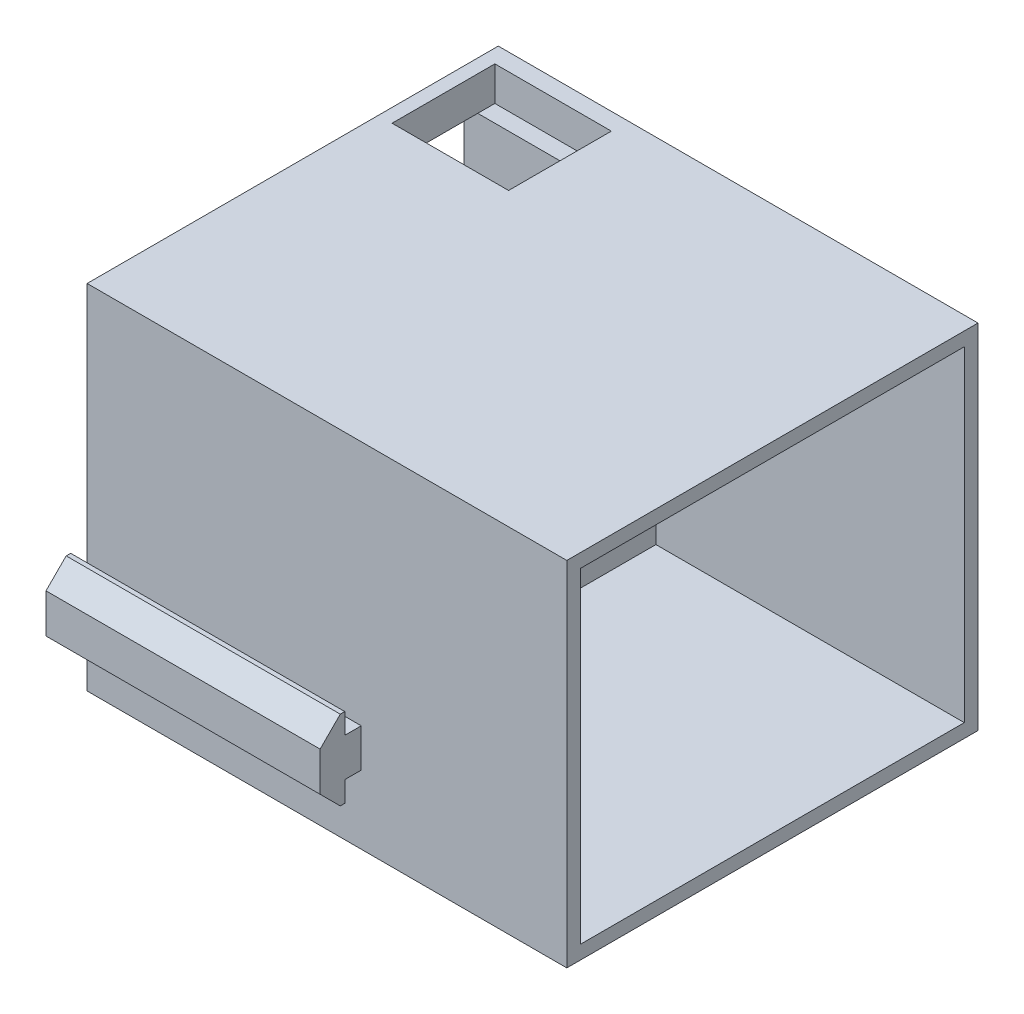
ISO-10303-21;
HEADER;
FILE_DESCRIPTION(('STEP AP214'),'2;1');
FILE_NAME('part.step','',(''),(''),'','','');
FILE_SCHEMA(('AUTOMOTIVE_DESIGN { 1 0 10303 214 1 1 1 1 }'));
ENDSEC;
DATA;
#1=APPLICATION_CONTEXT('core data for automotive mechanical design processes');
#2=APPLICATION_PROTOCOL_DEFINITION('international standard','automotive_design',2000,#1);
#3=PRODUCT_CONTEXT('',#1,'mechanical');
#4=PRODUCT('Part','Part','',(#3));
#5=PRODUCT_RELATED_PRODUCT_CATEGORY('part','',(#4));
#6=PRODUCT_DEFINITION_FORMATION('','',#4);
#7=PRODUCT_DEFINITION_CONTEXT('part definition',#1,'design');
#8=PRODUCT_DEFINITION('design','',#6,#7);
#9=PRODUCT_DEFINITION_SHAPE('','',#8);
#10=(LENGTH_UNIT() NAMED_UNIT(*) SI_UNIT(.MILLI.,.METRE.));
#11=(NAMED_UNIT(*) PLANE_ANGLE_UNIT() SI_UNIT($,.RADIAN.));
#12=(NAMED_UNIT(*) SI_UNIT($,.STERADIAN.) SOLID_ANGLE_UNIT());
#13=UNCERTAINTY_MEASURE_WITH_UNIT(LENGTH_MEASURE(1.E-05),#10,'distance_accuracy_value','');
#14=(GEOMETRIC_REPRESENTATION_CONTEXT(3) GLOBAL_UNCERTAINTY_ASSIGNED_CONTEXT((#13)) GLOBAL_UNIT_ASSIGNED_CONTEXT((#10,
#11,#12)) REPRESENTATION_CONTEXT('',''));
#15=CARTESIAN_POINT('',(0.,0.,0.));
#16=DIRECTION('',(0.,0.,1.));
#17=DIRECTION('',(1.,0.,0.));
#18=AXIS2_PLACEMENT_3D('',#15,#16,#17);
#19=CARTESIAN_POINT('',(135.,33.7,15.2));
#20=DIRECTION('',(0.,0.,-1.));
#21=DIRECTION('',(0.,1.,0.));
#22=AXIS2_PLACEMENT_3D('',#19,#20,#21);
#23=PLANE('',#22);
#24=DIRECTION('',(-1.,0.,0.));
#25=VECTOR('',#24,1.);
#26=CARTESIAN_POINT('',(135.,-7.8,15.2));
#27=LINE('',#26,#25);
#28=CARTESIAN_POINT('',(80.,-7.8,15.2));
#29=VERTEX_POINT('',#28);
#30=CARTESIAN_POINT('',(65.,-7.8,15.2));
#31=VERTEX_POINT('',#30);
#32=EDGE_CURVE('E421',#29,#31,#27,.T.);
#33=ORIENTED_EDGE('',*,*,#32,.F.);
#34=DIRECTION('',(0.,-1.,0.));
#35=VECTOR('',#34,1.);
#36=CARTESIAN_POINT('',(80.,33.7,15.2));
#37=LINE('',#36,#35);
#38=CARTESIAN_POINT('',(80.,33.7,15.2));
#39=VERTEX_POINT('',#38);
#40=EDGE_CURVE('E362',#39,#29,#37,.T.);
#41=ORIENTED_EDGE('',*,*,#40,.F.);
#42=DIRECTION('',(1.,0.,0.));
#43=VECTOR('',#42,1.);
#44=CARTESIAN_POINT('',(135.,33.7,15.2));
#45=LINE('',#44,#43);
#46=CARTESIAN_POINT('',(67.,33.7,15.2));
#47=VERTEX_POINT('',#46);
#48=EDGE_CURVE('E400',#47,#39,#45,.T.);
#49=ORIENTED_EDGE('',*,*,#48,.F.);
#50=DIRECTION('',(-1.,0.,0.));
#51=VECTOR('',#50,1.);
#52=CARTESIAN_POINT('',(135.,33.7,15.2));
#53=LINE('',#52,#51);
#54=CARTESIAN_POINT('',(65.,33.7,15.2));
#55=VERTEX_POINT('',#54);
#56=EDGE_CURVE('E422',#47,#55,#53,.T.);
#57=ORIENTED_EDGE('',*,*,#56,.T.);
#58=DIRECTION('',(0.,-1.,0.));
#59=VECTOR('',#58,1.);
#60=CARTESIAN_POINT('',(65.,33.7,15.2));
#61=LINE('',#60,#59);
#62=EDGE_CURVE('E409',#55,#31,#61,.T.);
#63=ORIENTED_EDGE('',*,*,#62,.T.);
#64=EDGE_LOOP('',(#33,#41,#49,#57,#63));
#65=FACE_BOUND('',#64,.T.);
#66=ADVANCED_FACE('F43',(#65),#23,.F.);
#67=CARTESIAN_POINT('',(135.,33.7,25.2));
#68=DIRECTION('',(0.,0.,1.));
#69=DIRECTION('',(0.,-1.,0.));
#70=AXIS2_PLACEMENT_3D('',#67,#68,#69);
#71=PLANE('',#70);
#72=DIRECTION('',(-1.,0.,0.));
#73=VECTOR('',#72,1.);
#74=CARTESIAN_POINT('',(135.,33.7,25.2));
#75=LINE('',#74,#73);
#76=CARTESIAN_POINT('',(80.,33.7,25.2));
#77=VERTEX_POINT('',#76);
#78=CARTESIAN_POINT('',(67.,33.7,25.2));
#79=VERTEX_POINT('',#78);
#80=EDGE_CURVE('E425',#77,#79,#75,.T.);
#81=ORIENTED_EDGE('',*,*,#80,.F.);
#82=DIRECTION('',(0.,1.,0.));
#83=VECTOR('',#82,1.);
#84=CARTESIAN_POINT('',(80.,33.7,25.2));
#85=LINE('',#84,#83);
#86=CARTESIAN_POINT('',(80.,-7.8,25.2));
#87=VERTEX_POINT('',#86);
#88=EDGE_CURVE('E66',#87,#77,#85,.T.);
#89=ORIENTED_EDGE('',*,*,#88,.F.);
#90=DIRECTION('',(-1.,0.,0.));
#91=VECTOR('',#90,1.);
#92=CARTESIAN_POINT('',(135.,-7.8,25.2));
#93=LINE('',#92,#91);
#94=CARTESIAN_POINT('',(65.,-7.8,25.2));
#95=VERTEX_POINT('',#94);
#96=EDGE_CURVE('E428',#87,#95,#93,.T.);
#97=ORIENTED_EDGE('',*,*,#96,.T.);
#98=DIRECTION('',(0.,1.,0.));
#99=VECTOR('',#98,1.);
#100=CARTESIAN_POINT('',(65.,33.7,25.2));
#101=LINE('',#100,#99);
#102=CARTESIAN_POINT('',(65.,33.7,25.2));
#103=VERTEX_POINT('',#102);
#104=EDGE_CURVE('E415',#95,#103,#101,.T.);
#105=ORIENTED_EDGE('',*,*,#104,.T.);
#106=EDGE_CURVE('E427',#79,#103,#75,.T.);
#107=ORIENTED_EDGE('',*,*,#106,.F.);
#108=EDGE_LOOP('',(#81,#89,#97,#105,#107));
#109=FACE_BOUND('',#108,.T.);
#110=ADVANCED_FACE('F489',(#109),#71,.F.);
#111=CARTESIAN_POINT('',(135.,-7.8,15.2));
#112=DIRECTION('',(0.,-1.,0.));
#113=DIRECTION('',(0.,0.,-1.));
#114=AXIS2_PLACEMENT_3D('',#111,#112,#113);
#115=PLANE('',#114);
#116=ORIENTED_EDGE('',*,*,#96,.F.);
#117=DIRECTION('',(0.,0.,1.));
#118=VECTOR('',#117,1.);
#119=CARTESIAN_POINT('',(80.,-7.8,15.2));
#120=LINE('',#119,#118);
#121=EDGE_CURVE('E366',#29,#87,#120,.T.);
#122=ORIENTED_EDGE('',*,*,#121,.F.);
#123=ORIENTED_EDGE('',*,*,#32,.T.);
#124=DIRECTION('',(0.,0.,1.));
#125=VECTOR('',#124,1.);
#126=CARTESIAN_POINT('',(65.,-7.8,15.2));
#127=LINE('',#126,#125);
#128=EDGE_CURVE('E412',#31,#95,#127,.T.);
#129=ORIENTED_EDGE('',*,*,#128,.T.);
#130=EDGE_LOOP('',(#116,#122,#123,#129));
#131=FACE_BOUND('',#130,.T.);
#132=ADVANCED_FACE('F495',(#131),#115,.F.);
#133=CARTESIAN_POINT('',(135.,33.7,15.2));
#134=DIRECTION('',(0.,1.,0.));
#135=DIRECTION('',(0.,0.,1.));
#136=AXIS2_PLACEMENT_3D('',#133,#134,#135);
#137=PLANE('',#136);
#138=ORIENTED_EDGE('',*,*,#56,.F.);
#139=DIRECTION('',(0.,0.,1.));
#140=VECTOR('',#139,1.);
#141=CARTESIAN_POINT('',(67.,33.7,12.7));
#142=LINE('',#141,#140);
#143=EDGE_CURVE('E378',#47,#79,#142,.T.);
#144=ORIENTED_EDGE('',*,*,#143,.T.);
#145=ORIENTED_EDGE('',*,*,#106,.T.);
#146=DIRECTION('',(0.,0.,-1.));
#147=VECTOR('',#146,1.);
#148=CARTESIAN_POINT('',(65.,33.7,15.2));
#149=LINE('',#148,#147);
#150=EDGE_CURVE('E418',#103,#55,#149,.T.);
#151=ORIENTED_EDGE('',*,*,#150,.T.);
#152=EDGE_LOOP('',(#138,#144,#145,#151));
#153=FACE_BOUND('',#152,.T.);
#154=ADVANCED_FACE('F500',(#153),#137,.F.);
#155=CARTESIAN_POINT('',(65.,0.,0.));
#156=DIRECTION('',(1.,0.,0.));
#157=DIRECTION('',(0.,0.,-1.));
#158=AXIS2_PLACEMENT_3D('',#155,#156,#157);
#159=PLANE('',#158);
#160=DIRECTION('',(0.,-1.,0.));
#161=VECTOR('',#160,1.);
#162=CARTESIAN_POINT('',(65.,35.7,30.2));
#163=LINE('',#162,#161);
#164=CARTESIAN_POINT('',(65.,36.7,30.2));
#165=VERTEX_POINT('',#164);
#166=CARTESIAN_POINT('',(65.,-10.8,30.2));
#167=VERTEX_POINT('',#166);
#168=EDGE_CURVE('E248',#165,#167,#163,.T.);
#169=ORIENTED_EDGE('',*,*,#168,.F.);
#170=DIRECTION('',(0.,0.,1.));
#171=VECTOR('',#170,1.);
#172=CARTESIAN_POINT('',(65.,36.7,0.));
#173=LINE('',#172,#171);
#174=CARTESIAN_POINT('',(65.,36.7,68.2));
#175=VERTEX_POINT('',#174);
#176=EDGE_CURVE('E961',#165,#175,#173,.T.);
#177=ORIENTED_EDGE('',*,*,#176,.T.);
#178=DIRECTION('',(0.,-1.,0.));
#179=VECTOR('',#178,1.);
#180=CARTESIAN_POINT('',(65.,0.,68.2));
#181=LINE('',#180,#179);
#182=CARTESIAN_POINT('',(65.,-10.8,68.2));
#183=VERTEX_POINT('',#182);
#184=EDGE_CURVE('E963',#175,#183,#181,.T.);
#185=ORIENTED_EDGE('',*,*,#184,.T.);
#186=DIRECTION('',(0.,0.,-1.));
#187=VECTOR('',#186,1.);
#188=CARTESIAN_POINT('',(65.,-10.8,0.));
#189=LINE('',#188,#187);
#190=EDGE_CURVE('E962',#183,#167,#189,.T.);
#191=ORIENTED_EDGE('',*,*,#190,.T.);
#192=EDGE_LOOP('',(#169,#177,#185,#191));
#193=FACE_BOUND('',#192,.T.);
#194=DIRECTION('',(0.,-1.,0.));
#195=VECTOR('',#194,1.);
#196=CARTESIAN_POINT('',(65.,-12.8,10.2));
#197=LINE('',#196,#195);
#198=CARTESIAN_POINT('',(65.,38.7,10.2));
#199=VERTEX_POINT('',#198);
#200=CARTESIAN_POINT('',(65.,-12.8,10.2));
#201=VERTEX_POINT('',#200);
#202=EDGE_CURVE('E424',#199,#201,#197,.T.);
#203=ORIENTED_EDGE('',*,*,#202,.T.);
#204=DIRECTION('',(0.,0.,1.));
#205=VECTOR('',#204,1.);
#206=CARTESIAN_POINT('',(65.,-12.8,10.2));
#207=LINE('',#206,#205);
#208=CARTESIAN_POINT('',(65.,-12.8,70.2));
#209=VERTEX_POINT('',#208);
#210=EDGE_CURVE('E442',#201,#209,#207,.T.);
#211=ORIENTED_EDGE('',*,*,#210,.T.);
#212=DIRECTION('',(0.,-1.,0.));
#213=VECTOR('',#212,1.);
#214=CARTESIAN_POINT('',(65.,38.7,70.2));
#215=LINE('',#214,#213);
#216=CARTESIAN_POINT('',(65.,-2.8,70.2));
#217=VERTEX_POINT('',#216);
#218=EDGE_CURVE('E317',#217,#209,#215,.T.);
#219=ORIENTED_EDGE('',*,*,#218,.F.);
#220=DIRECTION('',(0.,0.,-1.));
#221=VECTOR('',#220,1.);
#222=CARTESIAN_POINT('',(65.,-2.80000000000005,0.));
#223=LINE('',#222,#221);
#224=CARTESIAN_POINT('',(65.,-2.8,72.6));
#225=VERTEX_POINT('',#224);
#226=EDGE_CURVE('E58',#225,#217,#223,.T.);
#227=ORIENTED_EDGE('',*,*,#226,.F.);
#228=DIRECTION('',(0.,1.,0.));
#229=VECTOR('',#228,1.);
#230=CARTESIAN_POINT('',(65.,0.,72.6));
#231=LINE('',#230,#229);
#232=CARTESIAN_POINT('',(65.,-5.8,72.6));
#233=VERTEX_POINT('',#232);
#234=EDGE_CURVE('E303',#233,#225,#231,.T.);
#235=ORIENTED_EDGE('',*,*,#234,.F.);
#236=DIRECTION('',(0.,0.,-1.));
#237=VECTOR('',#236,1.);
#238=CARTESIAN_POINT('',(65.,-5.8000000000001,0.));
#239=LINE('',#238,#237);
#240=CARTESIAN_POINT('',(65.,-5.8,73.2564971157456));
#241=VERTEX_POINT('',#240);
#242=EDGE_CURVE('E305',#241,#233,#239,.T.);
#243=ORIENTED_EDGE('',*,*,#242,.F.);
#244=DIRECTION('',(0.,-0.707106781186549,-0.707106781186546));
#245=VECTOR('',#244,1.);
#246=CARTESIAN_POINT('',(65.,-39.5282485578728,39.5282485578729));
#247=LINE('',#246,#245);
#248=CARTESIAN_POINT('',(65.,-2.85649711574556,76.2));
#249=VERTEX_POINT('',#248);
#250=EDGE_CURVE('E307',#249,#241,#247,.T.);
#251=ORIENTED_EDGE('',*,*,#250,.F.);
#252=DIRECTION('',(0.,-1.,0.));
#253=VECTOR('',#252,1.);
#254=CARTESIAN_POINT('',(65.,0.,76.2));
#255=LINE('',#254,#253);
#256=CARTESIAN_POINT('',(65.,2.85649711574556,76.2));
#257=VERTEX_POINT('',#256);
#258=EDGE_CURVE('E309',#257,#249,#255,.T.);
#259=ORIENTED_EDGE('',*,*,#258,.F.);
#260=DIRECTION('',(0.,-0.70710678118655,0.707106781186545));
#261=VECTOR('',#260,1.);
#262=CARTESIAN_POINT('',(65.,39.5282485578728,39.528248557873));
#263=LINE('',#262,#261);
#264=CARTESIAN_POINT('',(65.,5.8,73.2564971157456));
#265=VERTEX_POINT('',#264);
#266=EDGE_CURVE('E311',#265,#257,#263,.T.);
#267=ORIENTED_EDGE('',*,*,#266,.F.);
#268=DIRECTION('',(0.,0.,1.));
#269=VECTOR('',#268,1.);
#270=CARTESIAN_POINT('',(65.,5.8,0.));
#271=LINE('',#270,#269);
#272=CARTESIAN_POINT('',(65.,5.8,72.6));
#273=VERTEX_POINT('',#272);
#274=EDGE_CURVE('E279',#273,#265,#271,.T.);
#275=ORIENTED_EDGE('',*,*,#274,.F.);
#276=DIRECTION('',(0.,1.,0.));
#277=VECTOR('',#276,1.);
#278=CARTESIAN_POINT('',(65.,0.,72.6));
#279=LINE('',#278,#277);
#280=CARTESIAN_POINT('',(65.,2.8,72.6));
#281=VERTEX_POINT('',#280);
#282=EDGE_CURVE('E273',#281,#273,#279,.T.);
#283=ORIENTED_EDGE('',*,*,#282,.F.);
#284=DIRECTION('',(0.,0.,1.));
#285=VECTOR('',#284,1.);
#286=CARTESIAN_POINT('',(65.,2.79999999999999,0.));
#287=LINE('',#286,#285);
#288=CARTESIAN_POINT('',(65.,2.8,70.2));
#289=VERTEX_POINT('',#288);
#290=EDGE_CURVE('E300',#289,#281,#287,.T.);
#291=ORIENTED_EDGE('',*,*,#290,.F.);
#292=CARTESIAN_POINT('',(65.,38.7,70.2));
#293=VERTEX_POINT('',#292);
#294=EDGE_CURVE('E341',#293,#289,#215,.T.);
#295=ORIENTED_EDGE('',*,*,#294,.F.);
#296=DIRECTION('',(0.,0.,-1.));
#297=VECTOR('',#296,1.);
#298=CARTESIAN_POINT('',(65.,38.7,10.2));
#299=LINE('',#298,#297);
#300=EDGE_CURVE('E435',#293,#199,#299,.T.);
#301=ORIENTED_EDGE('',*,*,#300,.T.);
#302=EDGE_LOOP('',(#203,#211,#219,#227,#235,#243,#251,#259,#267,#275,#283,#291,#295,#301));
#303=FACE_BOUND('',#302,.T.);
#304=ORIENTED_EDGE('',*,*,#128,.F.);
#305=ORIENTED_EDGE('',*,*,#62,.F.);
#306=ORIENTED_EDGE('',*,*,#150,.F.);
#307=ORIENTED_EDGE('',*,*,#104,.F.);
#308=EDGE_LOOP('',(#304,#305,#306,#307));
#309=FACE_BOUND('',#308,.T.);
#310=ADVANCED_FACE('F45',(#193,#303,#309),#159,.F.);
#311=CARTESIAN_POINT('',(135.,-12.8,10.2));
#312=DIRECTION('',(0.,0.,-1.));
#313=DIRECTION('',(-1.,0.,0.));
#314=AXIS2_PLACEMENT_3D('',#311,#312,#313);
#315=PLANE('',#314);
#316=DIRECTION('',(-1.,0.,0.));
#317=VECTOR('',#316,1.);
#318=CARTESIAN_POINT('',(135.,-12.8,10.2));
#319=LINE('',#318,#317);
#320=CARTESIAN_POINT('',(135.,-12.8,10.2));
#321=VERTEX_POINT('',#320);
#322=EDGE_CURVE('E440',#321,#201,#319,.T.);
#323=ORIENTED_EDGE('',*,*,#322,.T.);
#324=ORIENTED_EDGE('',*,*,#202,.F.);
#325=DIRECTION('',(-1.,0.,0.));
#326=VECTOR('',#325,1.);
#327=CARTESIAN_POINT('',(135.,38.7,10.2));
#328=LINE('',#327,#326);
#329=CARTESIAN_POINT('',(135.,38.7,10.2));
#330=VERTEX_POINT('',#329);
#331=EDGE_CURVE('E51',#330,#199,#328,.T.);
#332=ORIENTED_EDGE('',*,*,#331,.F.);
#333=DIRECTION('',(0.,-1.,0.));
#334=VECTOR('',#333,1.);
#335=CARTESIAN_POINT('',(135.,-12.8,10.2));
#336=LINE('',#335,#334);
#337=EDGE_CURVE('E431',#330,#321,#336,.T.);
#338=ORIENTED_EDGE('',*,*,#337,.T.);
#339=EDGE_LOOP('',(#323,#324,#332,#338));
#340=FACE_BOUND('',#339,.T.);
#341=ADVANCED_FACE('F451',(#340),#315,.T.);
#342=CARTESIAN_POINT('',(135.,38.7,10.2));
#343=DIRECTION('',(0.,1.,0.));
#344=DIRECTION('',(0.,0.,1.));
#345=AXIS2_PLACEMENT_3D('',#342,#343,#344);
#346=PLANE('',#345);
#347=ORIENTED_EDGE('',*,*,#331,.T.);
#348=ORIENTED_EDGE('',*,*,#300,.F.);
#349=DIRECTION('',(-1.,0.,0.));
#350=VECTOR('',#349,1.);
#351=CARTESIAN_POINT('',(65.,38.7,70.2));
#352=LINE('',#351,#350);
#353=CARTESIAN_POINT('',(135.,38.7,70.2));
#354=VERTEX_POINT('',#353);
#355=EDGE_CURVE('E350',#354,#293,#352,.T.);
#356=ORIENTED_EDGE('',*,*,#355,.F.);
#357=DIRECTION('',(0.,0.,-1.));
#358=VECTOR('',#357,1.);
#359=CARTESIAN_POINT('',(135.,38.7,10.2));
#360=LINE('',#359,#358);
#361=EDGE_CURVE('E437',#354,#330,#360,.T.);
#362=ORIENTED_EDGE('',*,*,#361,.T.);
#363=EDGE_LOOP('',(#347,#348,#356,#362));
#364=FACE_BOUND('',#363,.T.);
#365=DIRECTION('',(0.,0.,1.));
#366=VECTOR('',#365,1.);
#367=CARTESIAN_POINT('',(67.,38.7,12.7));
#368=LINE('',#367,#366);
#369=CARTESIAN_POINT('',(67.,38.7,12.7));
#370=VERTEX_POINT('',#369);
#371=CARTESIAN_POINT('',(67.,38.7,27.7));
#372=VERTEX_POINT('',#371);
#373=EDGE_CURVE('E373',#370,#372,#368,.T.);
#374=ORIENTED_EDGE('',*,*,#373,.F.);
#375=DIRECTION('',(-1.,0.,0.));
#376=VECTOR('',#375,1.);
#377=CARTESIAN_POINT('',(67.,38.7,12.7));
#378=LINE('',#377,#376);
#379=CARTESIAN_POINT('',(84.,38.7,12.7));
#380=VERTEX_POINT('',#379);
#381=EDGE_CURVE('E395',#380,#370,#378,.T.);
#382=ORIENTED_EDGE('',*,*,#381,.F.);
#383=DIRECTION('',(0.,0.,-1.));
#384=VECTOR('',#383,1.);
#385=CARTESIAN_POINT('',(84.,38.7,12.7));
#386=LINE('',#385,#384);
#387=CARTESIAN_POINT('',(84.,38.7,27.7));
#388=VERTEX_POINT('',#387);
#389=EDGE_CURVE('E392',#388,#380,#386,.T.);
#390=ORIENTED_EDGE('',*,*,#389,.F.);
#391=DIRECTION('',(1.,0.,0.));
#392=VECTOR('',#391,1.);
#393=CARTESIAN_POINT('',(67.,38.7,27.7));
#394=LINE('',#393,#392);
#395=EDGE_CURVE('E389',#372,#388,#394,.T.);
#396=ORIENTED_EDGE('',*,*,#395,.F.);
#397=EDGE_LOOP('',(#374,#382,#390,#396));
#398=FACE_BOUND('',#397,.T.);
#399=ADVANCED_FACE('F464',(#364,#398),#346,.T.);
#400=CARTESIAN_POINT('',(135.,-12.8,10.2));
#401=DIRECTION('',(0.,-1.,0.));
#402=DIRECTION('',(0.,0.,-1.));
#403=AXIS2_PLACEMENT_3D('',#400,#401,#402);
#404=PLANE('',#403);
#405=DIRECTION('',(0.,0.,1.));
#406=VECTOR('',#405,1.);
#407=CARTESIAN_POINT('',(135.,-12.8,10.2));
#408=LINE('',#407,#406);
#409=CARTESIAN_POINT('',(135.,-12.8,70.2));
#410=VERTEX_POINT('',#409);
#411=EDGE_CURVE('E434',#321,#410,#408,.T.);
#412=ORIENTED_EDGE('',*,*,#411,.T.);
#413=DIRECTION('',(1.,0.,0.));
#414=VECTOR('',#413,1.);
#415=CARTESIAN_POINT('',(65.,-12.8,70.2));
#416=LINE('',#415,#414);
#417=EDGE_CURVE('E344',#209,#410,#416,.T.);
#418=ORIENTED_EDGE('',*,*,#417,.F.);
#419=ORIENTED_EDGE('',*,*,#210,.F.);
#420=ORIENTED_EDGE('',*,*,#322,.F.);
#421=EDGE_LOOP('',(#412,#418,#419,#420));
#422=FACE_BOUND('',#421,.T.);
#423=ADVANCED_FACE('F456',(#422),#404,.T.);
#424=CARTESIAN_POINT('',(135.,0.,0.));
#425=DIRECTION('',(1.,0.,0.));
#426=DIRECTION('',(0.,0.,-1.));
#427=AXIS2_PLACEMENT_3D('',#424,#425,#426);
#428=PLANE('',#427);
#429=DIRECTION('',(0.,-1.,0.));
#430=VECTOR('',#429,1.);
#431=CARTESIAN_POINT('',(135.,36.7,68.2));
#432=LINE('',#431,#430);
#433=CARTESIAN_POINT('',(135.,36.7,68.2));
#434=VERTEX_POINT('',#433);
#435=CARTESIAN_POINT('',(135.,-10.8,68.2));
#436=VERTEX_POINT('',#435);
#437=EDGE_CURVE('E260',#434,#436,#432,.T.);
#438=ORIENTED_EDGE('',*,*,#437,.F.);
#439=DIRECTION('',(0.,0.,1.));
#440=VECTOR('',#439,1.);
#441=CARTESIAN_POINT('',(135.,36.7,28.2));
#442=LINE('',#441,#440);
#443=CARTESIAN_POINT('',(135.,36.7,12.2));
#444=VERTEX_POINT('',#443);
#445=EDGE_CURVE('E358',#444,#434,#442,.T.);
#446=ORIENTED_EDGE('',*,*,#445,.F.);
#447=DIRECTION('',(0.,1.,0.));
#448=VECTOR('',#447,1.);
#449=CARTESIAN_POINT('',(135.,36.7,12.2));
#450=LINE('',#449,#448);
#451=CARTESIAN_POINT('',(135.,-10.8,12.2));
#452=VERTEX_POINT('',#451);
#453=EDGE_CURVE('E355',#452,#444,#450,.T.);
#454=ORIENTED_EDGE('',*,*,#453,.F.);
#455=DIRECTION('',(0.,0.,-1.));
#456=VECTOR('',#455,1.);
#457=CARTESIAN_POINT('',(135.,-10.8,28.2));
#458=LINE('',#457,#456);
#459=EDGE_CURVE('E353',#436,#452,#458,.T.);
#460=ORIENTED_EDGE('',*,*,#459,.F.);
#461=EDGE_LOOP('',(#438,#446,#454,#460));
#462=FACE_BOUND('',#461,.T.);
#463=ORIENTED_EDGE('',*,*,#337,.F.);
#464=ORIENTED_EDGE('',*,*,#361,.F.);
#465=DIRECTION('',(0.,1.,0.));
#466=VECTOR('',#465,1.);
#467=CARTESIAN_POINT('',(135.,38.7,70.2));
#468=LINE('',#467,#466);
#469=EDGE_CURVE('E347',#410,#354,#468,.T.);
#470=ORIENTED_EDGE('',*,*,#469,.F.);
#471=ORIENTED_EDGE('',*,*,#411,.F.);
#472=EDGE_LOOP('',(#463,#464,#470,#471));
#473=FACE_BOUND('',#472,.T.);
#474=ADVANCED_FACE('F471',(#462,#473),#428,.T.);
#475=CARTESIAN_POINT('',(0.,33.7,0.));
#476=DIRECTION('',(0.,1.,0.));
#477=DIRECTION('',(0.,0.,1.));
#478=AXIS2_PLACEMENT_3D('',#475,#476,#477);
#479=PLANE('',#478);
#480=ORIENTED_EDGE('',*,*,#48,.T.);
#481=DIRECTION('',(0.,0.,-1.));
#482=VECTOR('',#481,1.);
#483=CARTESIAN_POINT('',(80.,33.7,15.2));
#484=LINE('',#483,#482);
#485=EDGE_CURVE('E370',#77,#39,#484,.T.);
#486=ORIENTED_EDGE('',*,*,#485,.F.);
#487=ORIENTED_EDGE('',*,*,#80,.T.);
#488=CARTESIAN_POINT('',(67.,33.7,27.7));
#489=VERTEX_POINT('',#488);
#490=EDGE_CURVE('E379',#79,#489,#142,.T.);
#491=ORIENTED_EDGE('',*,*,#490,.T.);
#492=DIRECTION('',(1.,0.,0.));
#493=VECTOR('',#492,1.);
#494=CARTESIAN_POINT('',(67.,33.7,27.7));
#495=LINE('',#494,#493);
#496=CARTESIAN_POINT('',(84.,33.7,27.7));
#497=VERTEX_POINT('',#496);
#498=EDGE_CURVE('E377',#489,#497,#495,.T.);
#499=ORIENTED_EDGE('',*,*,#498,.T.);
#500=DIRECTION('',(0.,0.,-1.));
#501=VECTOR('',#500,1.);
#502=CARTESIAN_POINT('',(84.,33.7,12.7));
#503=LINE('',#502,#501);
#504=CARTESIAN_POINT('',(84.,33.7,12.7));
#505=VERTEX_POINT('',#504);
#506=EDGE_CURVE('E382',#497,#505,#503,.T.);
#507=ORIENTED_EDGE('',*,*,#506,.T.);
#508=DIRECTION('',(-1.,0.,0.));
#509=VECTOR('',#508,1.);
#510=CARTESIAN_POINT('',(67.,33.7,12.7));
#511=LINE('',#510,#509);
#512=CARTESIAN_POINT('',(67.,33.7,12.7));
#513=VERTEX_POINT('',#512);
#514=EDGE_CURVE('E384',#505,#513,#511,.T.);
#515=ORIENTED_EDGE('',*,*,#514,.T.);
#516=EDGE_CURVE('E374',#513,#47,#142,.T.);
#517=ORIENTED_EDGE('',*,*,#516,.T.);
#518=EDGE_LOOP('',(#480,#486,#487,#491,#499,#507,#515,#517));
#519=FACE_BOUND('',#518,.T.);
#520=ADVANCED_FACE('F473',(#519),#479,.T.);
#521=CARTESIAN_POINT('',(67.,33.7,12.7));
#522=DIRECTION('',(-1.,0.,0.));
#523=DIRECTION('',(0.,0.,1.));
#524=AXIS2_PLACEMENT_3D('',#521,#522,#523);
#525=PLANE('',#524);
#526=ORIENTED_EDGE('',*,*,#373,.T.);
#527=DIRECTION('',(0.,1.,0.));
#528=VECTOR('',#527,1.);
#529=CARTESIAN_POINT('',(67.,33.7,27.7));
#530=LINE('',#529,#528);
#531=EDGE_CURVE('E387',#489,#372,#530,.T.);
#532=ORIENTED_EDGE('',*,*,#531,.F.);
#533=ORIENTED_EDGE('',*,*,#490,.F.);
#534=ORIENTED_EDGE('',*,*,#143,.F.);
#535=ORIENTED_EDGE('',*,*,#516,.F.);
#536=DIRECTION('',(0.,1.,0.));
#537=VECTOR('',#536,1.);
#538=CARTESIAN_POINT('',(67.,33.7,12.7));
#539=LINE('',#538,#537);
#540=EDGE_CURVE('E398',#513,#370,#539,.T.);
#541=ORIENTED_EDGE('',*,*,#540,.T.);
#542=EDGE_LOOP('',(#526,#532,#533,#534,#535,#541));
#543=FACE_BOUND('',#542,.T.);
#544=ADVANCED_FACE('F481',(#543),#525,.F.);
#545=CARTESIAN_POINT('',(67.,33.7,12.7));
#546=DIRECTION('',(0.,0.,-1.));
#547=DIRECTION('',(-1.,0.,0.));
#548=AXIS2_PLACEMENT_3D('',#545,#546,#547);
#549=PLANE('',#548);
#550=ORIENTED_EDGE('',*,*,#381,.T.);
#551=ORIENTED_EDGE('',*,*,#540,.F.);
#552=ORIENTED_EDGE('',*,*,#514,.F.);
#553=DIRECTION('',(0.,1.,0.));
#554=VECTOR('',#553,1.);
#555=CARTESIAN_POINT('',(84.,33.7,12.7));
#556=LINE('',#555,#554);
#557=EDGE_CURVE('E401',#505,#380,#556,.T.);
#558=ORIENTED_EDGE('',*,*,#557,.T.);
#559=EDGE_LOOP('',(#550,#551,#552,#558));
#560=FACE_BOUND('',#559,.T.);
#561=ADVANCED_FACE('F508',(#560),#549,.F.);
#562=CARTESIAN_POINT('',(84.,33.7,12.7));
#563=DIRECTION('',(1.,0.,0.));
#564=DIRECTION('',(0.,0.,-1.));
#565=AXIS2_PLACEMENT_3D('',#562,#563,#564);
#566=PLANE('',#565);
#567=ORIENTED_EDGE('',*,*,#389,.T.);
#568=ORIENTED_EDGE('',*,*,#557,.F.);
#569=ORIENTED_EDGE('',*,*,#506,.F.);
#570=DIRECTION('',(0.,1.,0.));
#571=VECTOR('',#570,1.);
#572=CARTESIAN_POINT('',(84.,33.7,27.7));
#573=LINE('',#572,#571);
#574=EDGE_CURVE('E403',#497,#388,#573,.T.);
#575=ORIENTED_EDGE('',*,*,#574,.T.);
#576=EDGE_LOOP('',(#567,#568,#569,#575));
#577=FACE_BOUND('',#576,.T.);
#578=ADVANCED_FACE('F514',(#577),#566,.F.);
#579=CARTESIAN_POINT('',(67.,33.7,27.7));
#580=DIRECTION('',(0.,0.,1.));
#581=DIRECTION('',(1.,0.,0.));
#582=AXIS2_PLACEMENT_3D('',#579,#580,#581);
#583=PLANE('',#582);
#584=ORIENTED_EDGE('',*,*,#395,.T.);
#585=ORIENTED_EDGE('',*,*,#574,.F.);
#586=ORIENTED_EDGE('',*,*,#498,.F.);
#587=ORIENTED_EDGE('',*,*,#531,.T.);
#588=EDGE_LOOP('',(#584,#585,#586,#587));
#589=FACE_BOUND('',#588,.T.);
#590=ADVANCED_FACE('F510',(#589),#583,.F.);
#591=CARTESIAN_POINT('',(80.,0.,0.));
#592=DIRECTION('',(-1.,0.,0.));
#593=DIRECTION('',(0.,0.,1.));
#594=AXIS2_PLACEMENT_3D('',#591,#592,#593);
#595=PLANE('',#594);
#596=ORIENTED_EDGE('',*,*,#40,.T.);
#597=ORIENTED_EDGE('',*,*,#121,.T.);
#598=ORIENTED_EDGE('',*,*,#88,.T.);
#599=ORIENTED_EDGE('',*,*,#485,.T.);
#600=EDGE_LOOP('',(#596,#597,#598,#599));
#601=FACE_BOUND('',#600,.T.);
#602=ADVANCED_FACE('F513',(#601),#595,.T.);
#603=CARTESIAN_POINT('',(105.,36.7,28.2));
#604=DIRECTION('',(0.,1.,0.));
#605=DIRECTION('',(0.,0.,1.));
#606=AXIS2_PLACEMENT_3D('',#603,#604,#605);
#607=PLANE('',#606);
#608=ORIENTED_EDGE('',*,*,#445,.T.);
#609=DIRECTION('',(1.,0.,0.));
#610=VECTOR('',#609,1.);
#611=CARTESIAN_POINT('',(90.,36.7,68.2));
#612=LINE('',#611,#610);
#613=EDGE_CURVE('E270',#175,#434,#612,.T.);
#614=ORIENTED_EDGE('',*,*,#613,.F.);
#615=ORIENTED_EDGE('',*,*,#176,.F.);
#616=DIRECTION('',(1.,0.,0.));
#617=VECTOR('',#616,1.);
#618=CARTESIAN_POINT('',(45.,36.7,30.2));
#619=LINE('',#618,#617);
#620=CARTESIAN_POINT('',(90.,36.7,30.2));
#621=VERTEX_POINT('',#620);
#622=EDGE_CURVE('E252',#165,#621,#619,.T.);
#623=ORIENTED_EDGE('',*,*,#622,.T.);
#624=DIRECTION('',(0.,0.,1.));
#625=VECTOR('',#624,1.);
#626=CARTESIAN_POINT('',(90.,36.7,68.2));
#627=LINE('',#626,#625);
#628=CARTESIAN_POINT('',(90.,36.7,12.2));
#629=VERTEX_POINT('',#628);
#630=EDGE_CURVE('E241',#629,#621,#627,.T.);
#631=ORIENTED_EDGE('',*,*,#630,.F.);
#632=DIRECTION('',(1.,0.,0.));
#633=VECTOR('',#632,1.);
#634=CARTESIAN_POINT('',(105.,36.7,12.2));
#635=LINE('',#634,#633);
#636=EDGE_CURVE('E360',#629,#444,#635,.T.);
#637=ORIENTED_EDGE('',*,*,#636,.T.);
#638=EDGE_LOOP('',(#608,#614,#615,#623,#631,#637));
#639=FACE_BOUND('',#638,.T.);
#640=ADVANCED_FACE('F524',(#639),#607,.F.);
#641=CARTESIAN_POINT('',(105.,36.7,12.2));
#642=DIRECTION('',(0.,0.,-1.));
#643=DIRECTION('',(0.,1.,0.));
#644=AXIS2_PLACEMENT_3D('',#641,#642,#643);
#645=PLANE('',#644);
#646=ORIENTED_EDGE('',*,*,#453,.T.);
#647=ORIENTED_EDGE('',*,*,#636,.F.);
#648=DIRECTION('',(0.,1.,0.));
#649=VECTOR('',#648,1.);
#650=CARTESIAN_POINT('',(90.,36.7,12.2));
#651=LINE('',#650,#649);
#652=CARTESIAN_POINT('',(90.,-10.8,12.2));
#653=VERTEX_POINT('',#652);
#654=EDGE_CURVE('E259',#653,#629,#651,.T.);
#655=ORIENTED_EDGE('',*,*,#654,.F.);
#656=DIRECTION('',(1.,0.,0.));
#657=VECTOR('',#656,1.);
#658=CARTESIAN_POINT('',(105.,-10.8,12.2));
#659=LINE('',#658,#657);
#660=EDGE_CURVE('E257',#653,#452,#659,.T.);
#661=ORIENTED_EDGE('',*,*,#660,.T.);
#662=EDGE_LOOP('',(#646,#647,#655,#661));
#663=FACE_BOUND('',#662,.T.);
#664=ADVANCED_FACE('F528',(#663),#645,.F.);
#665=CARTESIAN_POINT('',(105.,-10.8,28.2));
#666=DIRECTION('',(0.,-1.,0.));
#667=DIRECTION('',(0.,0.,-1.));
#668=AXIS2_PLACEMENT_3D('',#665,#666,#667);
#669=PLANE('',#668);
#670=DIRECTION('',(1.,0.,0.));
#671=VECTOR('',#670,1.);
#672=CARTESIAN_POINT('',(90.,-10.8,68.2));
#673=LINE('',#672,#671);
#674=EDGE_CURVE('E268',#183,#436,#673,.T.);
#675=ORIENTED_EDGE('',*,*,#674,.T.);
#676=ORIENTED_EDGE('',*,*,#459,.T.);
#677=ORIENTED_EDGE('',*,*,#660,.F.);
#678=DIRECTION('',(0.,0.,-1.));
#679=VECTOR('',#678,1.);
#680=CARTESIAN_POINT('',(90.,-10.8,68.2));
#681=LINE('',#680,#679);
#682=CARTESIAN_POINT('',(90.,-10.8,30.2));
#683=VERTEX_POINT('',#682);
#684=EDGE_CURVE('E238',#683,#653,#681,.T.);
#685=ORIENTED_EDGE('',*,*,#684,.F.);
#686=DIRECTION('',(1.,0.,0.));
#687=VECTOR('',#686,1.);
#688=CARTESIAN_POINT('',(45.,-10.8,30.2));
#689=LINE('',#688,#687);
#690=EDGE_CURVE('E246',#167,#683,#689,.T.);
#691=ORIENTED_EDGE('',*,*,#690,.F.);
#692=ORIENTED_EDGE('',*,*,#190,.F.);
#693=EDGE_LOOP('',(#675,#676,#677,#685,#691,#692));
#694=FACE_BOUND('',#693,.T.);
#695=ADVANCED_FACE('F255',(#694),#669,.F.);
#696=CARTESIAN_POINT('',(0.,0.,70.2));
#697=DIRECTION('',(0.,0.,1.));
#698=DIRECTION('',(1.,0.,0.));
#699=AXIS2_PLACEMENT_3D('',#696,#697,#698);
#700=PLANE('',#699);
#701=DIRECTION('',(-1.,0.,0.));
#702=VECTOR('',#701,1.);
#703=CARTESIAN_POINT('',(105.,2.8,70.2));
#704=LINE('',#703,#702);
#705=CARTESIAN_POINT('',(105.,2.8,70.2));
#706=VERTEX_POINT('',#705);
#707=EDGE_CURVE('E337',#706,#289,#704,.T.);
#708=ORIENTED_EDGE('',*,*,#707,.F.);
#709=DIRECTION('',(0.,1.,0.));
#710=VECTOR('',#709,1.);
#711=CARTESIAN_POINT('',(105.,0.,70.2));
#712=LINE('',#711,#710);
#713=CARTESIAN_POINT('',(105.,-2.8,70.2));
#714=VERTEX_POINT('',#713);
#715=EDGE_CURVE('E281',#714,#706,#712,.T.);
#716=ORIENTED_EDGE('',*,*,#715,.F.);
#717=DIRECTION('',(-1.,0.,0.));
#718=VECTOR('',#717,1.);
#719=CARTESIAN_POINT('',(105.,-2.8,70.2));
#720=LINE('',#719,#718);
#721=EDGE_CURVE('E335',#714,#217,#720,.T.);
#722=ORIENTED_EDGE('',*,*,#721,.T.);
#723=ORIENTED_EDGE('',*,*,#218,.T.);
#724=ORIENTED_EDGE('',*,*,#417,.T.);
#725=ORIENTED_EDGE('',*,*,#469,.T.);
#726=ORIENTED_EDGE('',*,*,#355,.T.);
#727=ORIENTED_EDGE('',*,*,#294,.T.);
#728=EDGE_LOOP('',(#708,#716,#722,#723,#724,#725,#726,#727));
#729=FACE_BOUND('',#728,.T.);
#730=ADVANCED_FACE('F468',(#729),#700,.T.);
#731=CARTESIAN_POINT('',(105.,0.,72.6));
#732=DIRECTION('',(0.,0.,1.));
#733=DIRECTION('',(1.,0.,0.));
#734=AXIS2_PLACEMENT_3D('',#731,#732,#733);
#735=PLANE('',#734);
#736=ORIENTED_EDGE('',*,*,#282,.T.);
#737=DIRECTION('',(-1.,0.,0.));
#738=VECTOR('',#737,1.);
#739=CARTESIAN_POINT('',(105.,5.8,72.6));
#740=LINE('',#739,#738);
#741=CARTESIAN_POINT('',(105.,5.8,72.6));
#742=VERTEX_POINT('',#741);
#743=EDGE_CURVE('E314',#742,#273,#740,.T.);
#744=ORIENTED_EDGE('',*,*,#743,.F.);
#745=DIRECTION('',(0.,1.,0.));
#746=VECTOR('',#745,1.);
#747=CARTESIAN_POINT('',(105.,0.,72.6));
#748=LINE('',#747,#746);
#749=CARTESIAN_POINT('',(105.,2.8,72.6));
#750=VERTEX_POINT('',#749);
#751=EDGE_CURVE('E275',#750,#742,#748,.T.);
#752=ORIENTED_EDGE('',*,*,#751,.F.);
#753=DIRECTION('',(-1.,0.,0.));
#754=VECTOR('',#753,1.);
#755=CARTESIAN_POINT('',(105.,2.8,72.6));
#756=LINE('',#755,#754);
#757=EDGE_CURVE('E297',#750,#281,#756,.T.);
#758=ORIENTED_EDGE('',*,*,#757,.T.);
#759=EDGE_LOOP('',(#736,#744,#752,#758));
#760=FACE_BOUND('',#759,.T.);
#761=ADVANCED_FACE('F536',(#760),#735,.F.);
#762=CARTESIAN_POINT('',(105.,5.8,0.));
#763=DIRECTION('',(0.,-1.,0.));
#764=DIRECTION('',(0.,0.,-1.));
#765=AXIS2_PLACEMENT_3D('',#762,#763,#764);
#766=PLANE('',#765);
#767=ORIENTED_EDGE('',*,*,#274,.T.);
#768=DIRECTION('',(-1.,0.,0.));
#769=VECTOR('',#768,1.);
#770=CARTESIAN_POINT('',(105.,5.8,73.2564971157456));
#771=LINE('',#770,#769);
#772=CARTESIAN_POINT('',(105.,5.8,73.2564971157456));
#773=VERTEX_POINT('',#772);
#774=EDGE_CURVE('E318',#773,#265,#771,.T.);
#775=ORIENTED_EDGE('',*,*,#774,.F.);
#776=DIRECTION('',(0.,0.,1.));
#777=VECTOR('',#776,1.);
#778=CARTESIAN_POINT('',(105.,5.8,0.));
#779=LINE('',#778,#777);
#780=EDGE_CURVE('E295',#742,#773,#779,.T.);
#781=ORIENTED_EDGE('',*,*,#780,.F.);
#782=ORIENTED_EDGE('',*,*,#743,.T.);
#783=EDGE_LOOP('',(#767,#775,#781,#782));
#784=FACE_BOUND('',#783,.T.);
#785=ADVANCED_FACE('F539',(#784),#766,.F.);
#786=CARTESIAN_POINT('',(105.,39.5282485578728,39.528248557873));
#787=DIRECTION('',(0.,-0.707106781186545,-0.70710678118655));
#788=DIRECTION('',(0.,0.70710678118655,-0.707106781186545));
#789=AXIS2_PLACEMENT_3D('',#786,#787,#788);
#790=PLANE('',#789);
#791=ORIENTED_EDGE('',*,*,#266,.T.);
#792=DIRECTION('',(-1.,0.,0.));
#793=VECTOR('',#792,1.);
#794=CARTESIAN_POINT('',(105.,2.85649711574556,76.2));
#795=LINE('',#794,#793);
#796=CARTESIAN_POINT('',(105.,2.85649711574556,76.2));
#797=VERTEX_POINT('',#796);
#798=EDGE_CURVE('E321',#797,#257,#795,.T.);
#799=ORIENTED_EDGE('',*,*,#798,.F.);
#800=DIRECTION('',(0.,-0.70710678118655,0.707106781186545));
#801=VECTOR('',#800,1.);
#802=CARTESIAN_POINT('',(105.,39.5282485578728,39.528248557873));
#803=LINE('',#802,#801);
#804=EDGE_CURVE('E293',#773,#797,#803,.T.);
#805=ORIENTED_EDGE('',*,*,#804,.F.);
#806=ORIENTED_EDGE('',*,*,#774,.T.);
#807=EDGE_LOOP('',(#791,#799,#805,#806));
#808=FACE_BOUND('',#807,.T.);
#809=ADVANCED_FACE('F564',(#808),#790,.F.);
#810=CARTESIAN_POINT('',(105.,0.,76.2));
#811=DIRECTION('',(0.,0.,-1.));
#812=DIRECTION('',(-1.,0.,0.));
#813=AXIS2_PLACEMENT_3D('',#810,#811,#812);
#814=PLANE('',#813);
#815=ORIENTED_EDGE('',*,*,#258,.T.);
#816=DIRECTION('',(-1.,0.,0.));
#817=VECTOR('',#816,1.);
#818=CARTESIAN_POINT('',(105.,-2.85649711574556,76.2));
#819=LINE('',#818,#817);
#820=CARTESIAN_POINT('',(105.,-2.85649711574556,76.2));
#821=VERTEX_POINT('',#820);
#822=EDGE_CURVE('E324',#821,#249,#819,.T.);
#823=ORIENTED_EDGE('',*,*,#822,.F.);
#824=DIRECTION('',(0.,-1.,0.));
#825=VECTOR('',#824,1.);
#826=CARTESIAN_POINT('',(105.,0.,76.2));
#827=LINE('',#826,#825);
#828=EDGE_CURVE('E291',#797,#821,#827,.T.);
#829=ORIENTED_EDGE('',*,*,#828,.F.);
#830=ORIENTED_EDGE('',*,*,#798,.T.);
#831=EDGE_LOOP('',(#815,#823,#829,#830));
#832=FACE_BOUND('',#831,.T.);
#833=ADVANCED_FACE('F560',(#832),#814,.F.);
#834=CARTESIAN_POINT('',(105.,-39.5282485578728,39.5282485578729));
#835=DIRECTION('',(0.,0.707106781186546,-0.707106781186549));
#836=DIRECTION('',(0.,0.707106781186549,0.707106781186546));
#837=AXIS2_PLACEMENT_3D('',#834,#835,#836);
#838=PLANE('',#837);
#839=ORIENTED_EDGE('',*,*,#250,.T.);
#840=DIRECTION('',(-1.,0.,0.));
#841=VECTOR('',#840,1.);
#842=CARTESIAN_POINT('',(105.,-5.8,73.2564971157456));
#843=LINE('',#842,#841);
#844=CARTESIAN_POINT('',(105.,-5.8,73.2564971157456));
#845=VERTEX_POINT('',#844);
#846=EDGE_CURVE('E327',#845,#241,#843,.T.);
#847=ORIENTED_EDGE('',*,*,#846,.F.);
#848=DIRECTION('',(0.,-0.707106781186549,-0.707106781186546));
#849=VECTOR('',#848,1.);
#850=CARTESIAN_POINT('',(105.,-39.5282485578728,39.5282485578729));
#851=LINE('',#850,#849);
#852=EDGE_CURVE('E289',#821,#845,#851,.T.);
#853=ORIENTED_EDGE('',*,*,#852,.F.);
#854=ORIENTED_EDGE('',*,*,#822,.T.);
#855=EDGE_LOOP('',(#839,#847,#853,#854));
#856=FACE_BOUND('',#855,.T.);
#857=ADVANCED_FACE('F556',(#856),#838,.F.);
#858=CARTESIAN_POINT('',(105.,-5.8000000000001,0.));
#859=DIRECTION('',(0.,1.,0.));
#860=DIRECTION('',(0.,0.,1.));
#861=AXIS2_PLACEMENT_3D('',#858,#859,#860);
#862=PLANE('',#861);
#863=ORIENTED_EDGE('',*,*,#242,.T.);
#864=DIRECTION('',(-1.,0.,0.));
#865=VECTOR('',#864,1.);
#866=CARTESIAN_POINT('',(105.,-5.8,72.6));
#867=LINE('',#866,#865);
#868=CARTESIAN_POINT('',(105.,-5.8,72.6));
#869=VERTEX_POINT('',#868);
#870=EDGE_CURVE('E330',#869,#233,#867,.T.);
#871=ORIENTED_EDGE('',*,*,#870,.F.);
#872=DIRECTION('',(0.,0.,-1.));
#873=VECTOR('',#872,1.);
#874=CARTESIAN_POINT('',(105.,-5.8000000000001,0.));
#875=LINE('',#874,#873);
#876=EDGE_CURVE('E287',#845,#869,#875,.T.);
#877=ORIENTED_EDGE('',*,*,#876,.F.);
#878=ORIENTED_EDGE('',*,*,#846,.T.);
#879=EDGE_LOOP('',(#863,#871,#877,#878));
#880=FACE_BOUND('',#879,.T.);
#881=ADVANCED_FACE('F552',(#880),#862,.F.);
#882=CARTESIAN_POINT('',(105.,0.,72.6));
#883=DIRECTION('',(0.,0.,1.));
#884=DIRECTION('',(1.,0.,0.));
#885=AXIS2_PLACEMENT_3D('',#882,#883,#884);
#886=PLANE('',#885);
#887=ORIENTED_EDGE('',*,*,#234,.T.);
#888=DIRECTION('',(-1.,0.,0.));
#889=VECTOR('',#888,1.);
#890=CARTESIAN_POINT('',(105.,-2.8,72.6));
#891=LINE('',#890,#889);
#892=CARTESIAN_POINT('',(105.,-2.8,72.6));
#893=VERTEX_POINT('',#892);
#894=EDGE_CURVE('E333',#893,#225,#891,.T.);
#895=ORIENTED_EDGE('',*,*,#894,.F.);
#896=DIRECTION('',(0.,1.,0.));
#897=VECTOR('',#896,1.);
#898=CARTESIAN_POINT('',(105.,0.,72.6));
#899=LINE('',#898,#897);
#900=EDGE_CURVE('E285',#869,#893,#899,.T.);
#901=ORIENTED_EDGE('',*,*,#900,.F.);
#902=ORIENTED_EDGE('',*,*,#870,.T.);
#903=EDGE_LOOP('',(#887,#895,#901,#902));
#904=FACE_BOUND('',#903,.T.);
#905=ADVANCED_FACE('F549',(#904),#886,.F.);
#906=CARTESIAN_POINT('',(105.,-2.80000000000005,0.));
#907=DIRECTION('',(0.,1.,0.));
#908=DIRECTION('',(0.,0.,1.));
#909=AXIS2_PLACEMENT_3D('',#906,#907,#908);
#910=PLANE('',#909);
#911=ORIENTED_EDGE('',*,*,#226,.T.);
#912=ORIENTED_EDGE('',*,*,#721,.F.);
#913=DIRECTION('',(0.,0.,-1.));
#914=VECTOR('',#913,1.);
#915=CARTESIAN_POINT('',(105.,-2.80000000000005,0.));
#916=LINE('',#915,#914);
#917=EDGE_CURVE('E283',#893,#714,#916,.T.);
#918=ORIENTED_EDGE('',*,*,#917,.F.);
#919=ORIENTED_EDGE('',*,*,#894,.T.);
#920=EDGE_LOOP('',(#911,#912,#918,#919));
#921=FACE_BOUND('',#920,.T.);
#922=ADVANCED_FACE('F545',(#921),#910,.F.);
#923=CARTESIAN_POINT('',(105.,2.79999999999999,0.));
#924=DIRECTION('',(0.,-1.,0.));
#925=DIRECTION('',(0.,0.,-1.));
#926=AXIS2_PLACEMENT_3D('',#923,#924,#925);
#927=PLANE('',#926);
#928=ORIENTED_EDGE('',*,*,#290,.T.);
#929=ORIENTED_EDGE('',*,*,#757,.F.);
#930=DIRECTION('',(0.,0.,1.));
#931=VECTOR('',#930,1.);
#932=CARTESIAN_POINT('',(105.,2.79999999999999,0.));
#933=LINE('',#932,#931);
#934=EDGE_CURVE('E278',#706,#750,#933,.T.);
#935=ORIENTED_EDGE('',*,*,#934,.F.);
#936=ORIENTED_EDGE('',*,*,#707,.T.);
#937=EDGE_LOOP('',(#928,#929,#935,#936));
#938=FACE_BOUND('',#937,.T.);
#939=ADVANCED_FACE('F541',(#938),#927,.F.);
#940=CARTESIAN_POINT('',(105.,0.,0.));
#941=DIRECTION('',(-1.,0.,0.));
#942=DIRECTION('',(0.,0.,1.));
#943=AXIS2_PLACEMENT_3D('',#940,#941,#942);
#944=PLANE('',#943);
#945=ORIENTED_EDGE('',*,*,#751,.T.);
#946=ORIENTED_EDGE('',*,*,#780,.T.);
#947=ORIENTED_EDGE('',*,*,#804,.T.);
#948=ORIENTED_EDGE('',*,*,#828,.T.);
#949=ORIENTED_EDGE('',*,*,#852,.T.);
#950=ORIENTED_EDGE('',*,*,#876,.T.);
#951=ORIENTED_EDGE('',*,*,#900,.T.);
#952=ORIENTED_EDGE('',*,*,#917,.T.);
#953=ORIENTED_EDGE('',*,*,#715,.T.);
#954=ORIENTED_EDGE('',*,*,#934,.T.);
#955=EDGE_LOOP('',(#945,#946,#947,#948,#949,#950,#951,#952,#953,#954));
#956=FACE_BOUND('',#955,.T.);
#957=ADVANCED_FACE('F544',(#956),#944,.F.);
#958=CARTESIAN_POINT('',(90.,36.7,68.2));
#959=DIRECTION('',(0.,0.,1.));
#960=DIRECTION('',(1.,0.,0.));
#961=AXIS2_PLACEMENT_3D('',#958,#959,#960);
#962=PLANE('',#961);
#963=ORIENTED_EDGE('',*,*,#437,.T.);
#964=ORIENTED_EDGE('',*,*,#674,.F.);
#965=ORIENTED_EDGE('',*,*,#184,.F.);
#966=ORIENTED_EDGE('',*,*,#613,.T.);
#967=EDGE_LOOP('',(#963,#964,#965,#966));
#968=FACE_BOUND('',#967,.T.);
#969=ADVANCED_FACE('F574',(#968),#962,.F.);
#970=CARTESIAN_POINT('',(90.,0.,0.));
#971=DIRECTION('',(1.,0.,0.));
#972=DIRECTION('',(0.,0.,-1.));
#973=AXIS2_PLACEMENT_3D('',#970,#971,#972);
#974=PLANE('',#973);
#975=DIRECTION('',(0.,1.,0.));
#976=VECTOR('',#975,1.);
#977=CARTESIAN_POINT('',(90.,0.,30.2));
#978=LINE('',#977,#976);
#979=EDGE_CURVE('E11',#683,#621,#978,.T.);
#980=ORIENTED_EDGE('',*,*,#979,.F.);
#981=ORIENTED_EDGE('',*,*,#684,.T.);
#982=ORIENTED_EDGE('',*,*,#654,.T.);
#983=ORIENTED_EDGE('',*,*,#630,.T.);
#984=EDGE_LOOP('',(#980,#981,#982,#983));
#985=FACE_BOUND('',#984,.T.);
#986=ADVANCED_FACE('F235',(#985),#974,.T.);
#987=CARTESIAN_POINT('',(110.,35.7,30.2));
#988=DIRECTION('',(0.,0.,-1.));
#989=DIRECTION('',(0.,1.,0.));
#990=AXIS2_PLACEMENT_3D('',#987,#988,#989);
#991=PLANE('',#990);
#992=ORIENTED_EDGE('',*,*,#979,.T.);
#993=ORIENTED_EDGE('',*,*,#622,.F.);
#994=ORIENTED_EDGE('',*,*,#168,.T.);
#995=ORIENTED_EDGE('',*,*,#690,.T.);
#996=EDGE_LOOP('',(#992,#993,#994,#995));
#997=FACE_BOUND('',#996,.T.);
#998=ADVANCED_FACE('F247',(#997),#991,.F.);
#999=CLOSED_SHELL('',(#66,#110,#132,#154,#310,#341,#399,#423,#474,#520,#544,#561,#578,#590,#602,
#640,#664,#695,#730,#761,#785,#809,#833,#857,#881,#905,#922,#939,#957,#969,#986,#998));
#1000=MANIFOLD_SOLID_BREP('B2',#999);
#1001=ADVANCED_BREP_SHAPE_REPRESENTATION('',(#18,#1000),#14);
#1002=SHAPE_DEFINITION_REPRESENTATION(#9,#1001);
ENDSEC;
END-ISO-10303-21;
